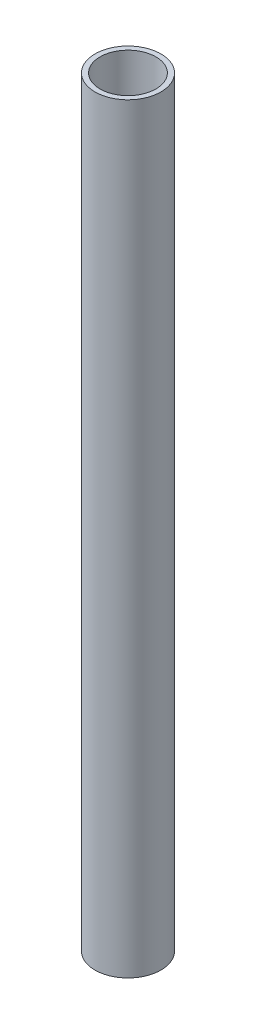
ISO-10303-21;
HEADER;
FILE_DESCRIPTION(('STEP AP214'),'2;1');
FILE_NAME('part.step','',(''),(''),'','','');
FILE_SCHEMA(('AUTOMOTIVE_DESIGN { 1 0 10303 214 1 1 1 1 }'));
ENDSEC;
DATA;
#1=APPLICATION_CONTEXT('core data for automotive mechanical design processes');
#2=APPLICATION_PROTOCOL_DEFINITION('international standard','automotive_design',2000,#1);
#3=PRODUCT_CONTEXT('',#1,'mechanical');
#4=PRODUCT('Part','Part','',(#3));
#5=PRODUCT_RELATED_PRODUCT_CATEGORY('part','',(#4));
#6=PRODUCT_DEFINITION_FORMATION('','',#4);
#7=PRODUCT_DEFINITION_CONTEXT('part definition',#1,'design');
#8=PRODUCT_DEFINITION('design','',#6,#7);
#9=PRODUCT_DEFINITION_SHAPE('','',#8);
#10=(LENGTH_UNIT() NAMED_UNIT(*) SI_UNIT(.MILLI.,.METRE.));
#11=(NAMED_UNIT(*) PLANE_ANGLE_UNIT() SI_UNIT($,.RADIAN.));
#12=(NAMED_UNIT(*) SI_UNIT($,.STERADIAN.) SOLID_ANGLE_UNIT());
#13=UNCERTAINTY_MEASURE_WITH_UNIT(LENGTH_MEASURE(1.E-05),#10,'distance_accuracy_value','');
#14=(GEOMETRIC_REPRESENTATION_CONTEXT(3) GLOBAL_UNCERTAINTY_ASSIGNED_CONTEXT((#13)) GLOBAL_UNIT_ASSIGNED_CONTEXT((#10,
#11,#12)) REPRESENTATION_CONTEXT('',''));
#15=CARTESIAN_POINT('',(0.,0.,0.));
#16=DIRECTION('',(0.,0.,1.));
#17=DIRECTION('',(1.,0.,0.));
#18=AXIS2_PLACEMENT_3D('',#15,#16,#17);
#19=CARTESIAN_POINT('',(0.,150.,0.));
#20=DIRECTION('',(0.,1.,0.));
#21=DIRECTION('',(0.,0.,1.));
#22=AXIS2_PLACEMENT_3D('',#19,#20,#21);
#23=PLANE('',#22);
#24=CARTESIAN_POINT('',(0.,150.,0.));
#25=DIRECTION('',(0.,1.,0.));
#26=DIRECTION('',(0.,0.,1.));
#27=AXIS2_PLACEMENT_3D('',#24,#25,#26);
#28=CIRCLE('',#27,13.);
#29=CARTESIAN_POINT('',(0.,150.,13.));
#30=VERTEX_POINT('',#29);
#31=EDGE_CURVE('E10',#30,#30,#28,.T.);
#32=ORIENTED_EDGE('',*,*,#31,.T.);
#33=EDGE_LOOP('',(#32));
#34=FACE_BOUND('',#33,.T.);
#35=CARTESIAN_POINT('',(0.,150.,0.));
#36=DIRECTION('',(0.,1.,0.));
#37=DIRECTION('',(0.,0.,1.));
#38=AXIS2_PLACEMENT_3D('',#35,#36,#37);
#39=CIRCLE('',#38,11.);
#40=CARTESIAN_POINT('',(0.,150.,11.));
#41=VERTEX_POINT('',#40);
#42=EDGE_CURVE('E46',#41,#41,#39,.T.);
#43=ORIENTED_EDGE('',*,*,#42,.F.);
#44=EDGE_LOOP('',(#43));
#45=FACE_BOUND('',#44,.T.);
#46=ADVANCED_FACE('F35',(#34,#45),#23,.T.);
#47=CARTESIAN_POINT('',(0.,-150.,0.));
#48=DIRECTION('',(0.,1.,0.));
#49=DIRECTION('',(0.,0.,1.));
#50=AXIS2_PLACEMENT_3D('',#47,#48,#49);
#51=PLANE('',#50);
#52=CARTESIAN_POINT('',(0.,-150.,0.));
#53=DIRECTION('',(0.,1.,0.));
#54=DIRECTION('',(0.,0.,1.));
#55=AXIS2_PLACEMENT_3D('',#52,#53,#54);
#56=CIRCLE('',#55,13.);
#57=CARTESIAN_POINT('',(0.,-150.,13.));
#58=VERTEX_POINT('',#57);
#59=EDGE_CURVE('E39',#58,#58,#56,.T.);
#60=ORIENTED_EDGE('',*,*,#59,.F.);
#61=EDGE_LOOP('',(#60));
#62=FACE_BOUND('',#61,.T.);
#63=CARTESIAN_POINT('',(0.,-150.,0.));
#64=DIRECTION('',(0.,1.,0.));
#65=DIRECTION('',(0.,0.,1.));
#66=AXIS2_PLACEMENT_3D('',#63,#64,#65);
#67=CIRCLE('',#66,11.);
#68=CARTESIAN_POINT('',(0.,-150.,11.));
#69=VERTEX_POINT('',#68);
#70=EDGE_CURVE('E48',#69,#69,#67,.T.);
#71=ORIENTED_EDGE('',*,*,#70,.T.);
#72=EDGE_LOOP('',(#71));
#73=FACE_BOUND('',#72,.T.);
#74=ADVANCED_FACE('F58',(#62,#73),#51,.F.);
#75=CARTESIAN_POINT('',(0.,150.,0.));
#76=DIRECTION('',(0.,-1.,0.));
#77=DIRECTION('',(0.,0.,-1.));
#78=AXIS2_PLACEMENT_3D('',#75,#76,#77);
#79=CYLINDRICAL_SURFACE('',#78,13.);
#80=ORIENTED_EDGE('',*,*,#31,.F.);
#81=EDGE_LOOP('',(#80));
#82=FACE_BOUND('',#81,.T.);
#83=ORIENTED_EDGE('',*,*,#59,.T.);
#84=EDGE_LOOP('',(#83));
#85=FACE_BOUND('',#84,.T.);
#86=ADVANCED_FACE('F37',(#82,#85),#79,.T.);
#87=CARTESIAN_POINT('',(0.,150.,0.));
#88=DIRECTION('',(0.,-1.,0.));
#89=DIRECTION('',(0.,0.,-1.));
#90=AXIS2_PLACEMENT_3D('',#87,#88,#89);
#91=CYLINDRICAL_SURFACE('',#90,11.);
#92=ORIENTED_EDGE('',*,*,#42,.T.);
#93=EDGE_LOOP('',(#92));
#94=FACE_BOUND('',#93,.T.);
#95=ORIENTED_EDGE('',*,*,#70,.F.);
#96=EDGE_LOOP('',(#95));
#97=FACE_BOUND('',#96,.T.);
#98=ADVANCED_FACE('F54',(#94,#97),#91,.F.);
#99=CLOSED_SHELL('',(#46,#74,#86,#98));
#100=MANIFOLD_SOLID_BREP('B2',#99);
#101=ADVANCED_BREP_SHAPE_REPRESENTATION('',(#18,#100),#14);
#102=SHAPE_DEFINITION_REPRESENTATION(#9,#101);
ENDSEC;
END-ISO-10303-21;
